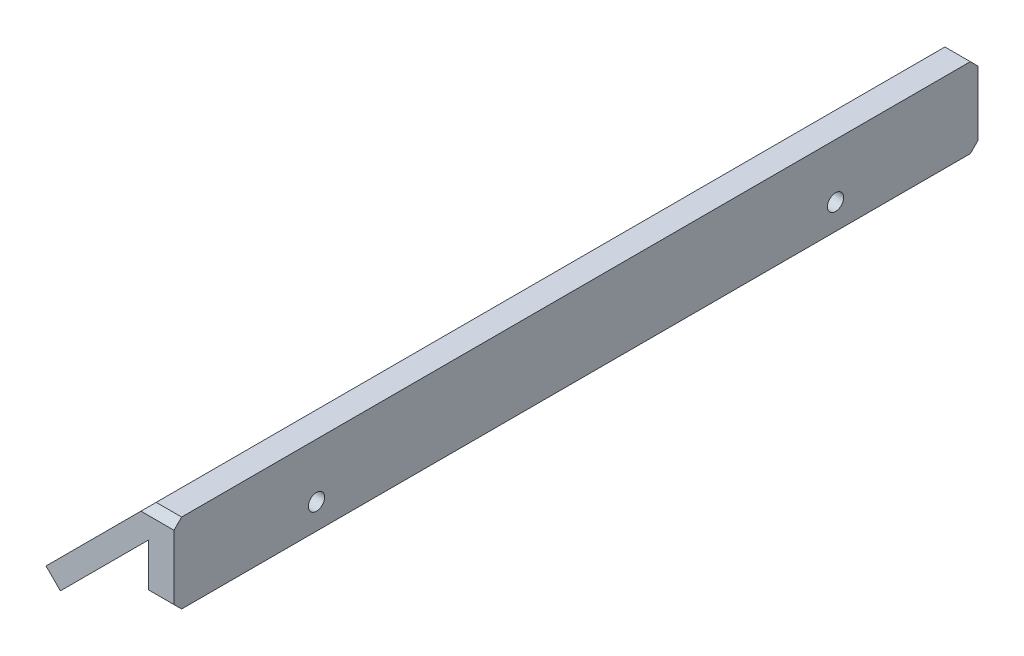
ISO-10303-21;
HEADER;
FILE_DESCRIPTION(('STEP AP214'),'2;1');
FILE_NAME('part.step','',(''),(''),'','','');
FILE_SCHEMA(('AUTOMOTIVE_DESIGN { 1 0 10303 214 1 1 1 1 }'));
ENDSEC;
DATA;
#1=APPLICATION_CONTEXT('core data for automotive mechanical design processes');
#2=APPLICATION_PROTOCOL_DEFINITION('international standard','automotive_design',2000,#1);
#3=PRODUCT_CONTEXT('',#1,'mechanical');
#4=PRODUCT('Part','Part','',(#3));
#5=PRODUCT_RELATED_PRODUCT_CATEGORY('part','',(#4));
#6=PRODUCT_DEFINITION_FORMATION('','',#4);
#7=PRODUCT_DEFINITION_CONTEXT('part definition',#1,'design');
#8=PRODUCT_DEFINITION('design','',#6,#7);
#9=PRODUCT_DEFINITION_SHAPE('','',#8);
#10=(LENGTH_UNIT() NAMED_UNIT(*) SI_UNIT(.MILLI.,.METRE.));
#11=(NAMED_UNIT(*) PLANE_ANGLE_UNIT() SI_UNIT($,.RADIAN.));
#12=(NAMED_UNIT(*) SI_UNIT($,.STERADIAN.) SOLID_ANGLE_UNIT());
#13=UNCERTAINTY_MEASURE_WITH_UNIT(LENGTH_MEASURE(1.E-05),#10,'distance_accuracy_value','');
#14=(GEOMETRIC_REPRESENTATION_CONTEXT(3) GLOBAL_UNCERTAINTY_ASSIGNED_CONTEXT((#13)) GLOBAL_UNIT_ASSIGNED_CONTEXT((#10,
#11,#12)) REPRESENTATION_CONTEXT('',''));
#15=CARTESIAN_POINT('',(0.,0.,0.));
#16=DIRECTION('',(0.,0.,1.));
#17=DIRECTION('',(1.,0.,0.));
#18=AXIS2_PLACEMENT_3D('',#15,#16,#17);
#19=CARTESIAN_POINT('',(-43.8051788486157,37.570905739196,158.));
#20=DIRECTION('',(-1.,0.,0.));
#21=DIRECTION('',(0.,0.,1.));
#22=AXIS2_PLACEMENT_3D('',#19,#20,#21);
#23=PLANE('',#22);
#24=CARTESIAN_POINT('',(-43.8051788486157,42.570905739196,130.));
#25=DIRECTION('',(1.,0.,0.));
#26=DIRECTION('',(0.,0.,-1.));
#27=AXIS2_PLACEMENT_3D('',#24,#25,#26);
#28=CIRCLE('',#27,1.59999999999999);
#29=CARTESIAN_POINT('',(-43.8051788486157,42.570905739196,128.4));
#30=VERTEX_POINT('',#29);
#31=EDGE_CURVE('E169',#30,#30,#28,.T.);
#32=ORIENTED_EDGE('',*,*,#31,.F.);
#33=EDGE_LOOP('',(#32));
#34=FACE_BOUND('',#33,.T.);
#35=CARTESIAN_POINT('',(-43.8051788486157,42.570905739196,28.));
#36=DIRECTION('',(1.,0.,0.));
#37=DIRECTION('',(0.,0.,-1.));
#38=AXIS2_PLACEMENT_3D('',#35,#36,#37);
#39=CIRCLE('',#38,1.6);
#40=CARTESIAN_POINT('',(-43.8051788486157,42.570905739196,26.4));
#41=VERTEX_POINT('',#40);
#42=EDGE_CURVE('E216',#41,#41,#39,.T.);
#43=ORIENTED_EDGE('',*,*,#42,.F.);
#44=EDGE_LOOP('',(#43));
#45=FACE_BOUND('',#44,.T.);
#46=DIRECTION('',(0.,1.,0.));
#47=VECTOR('',#46,1.);
#48=CARTESIAN_POINT('',(-43.8051788486157,37.570905739196,158.));
#49=LINE('',#48,#47);
#50=CARTESIAN_POINT('',(-43.8051788486157,39.070905739196,158.));
#51=VERTEX_POINT('',#50);
#52=CARTESIAN_POINT('',(-43.8051788486157,51.7277599886882,158.));
#53=VERTEX_POINT('',#52);
#54=EDGE_CURVE('E199',#51,#53,#49,.T.);
#55=ORIENTED_EDGE('',*,*,#54,.F.);
#56=DIRECTION('',(0.,0.707106781186547,0.707106781186547));
#57=VECTOR('',#56,1.);
#58=CARTESIAN_POINT('',(-43.8051788486157,37.570905739196,156.5));
#59=LINE('',#58,#57);
#60=CARTESIAN_POINT('',(-43.8051788486157,37.570905739196,156.5));
#61=VERTEX_POINT('',#60);
#62=EDGE_CURVE('E202',#61,#51,#59,.T.);
#63=ORIENTED_EDGE('',*,*,#62,.F.);
#64=DIRECTION('',(0.,0.,-1.));
#65=VECTOR('',#64,1.);
#66=CARTESIAN_POINT('',(-43.8051788486157,37.570905739196,158.));
#67=LINE('',#66,#65);
#68=CARTESIAN_POINT('',(-43.8051788486157,37.570905739196,1.5));
#69=VERTEX_POINT('',#68);
#70=EDGE_CURVE('E222',#61,#69,#67,.T.);
#71=ORIENTED_EDGE('',*,*,#70,.T.);
#72=DIRECTION('',(0.,-0.707106781186548,0.707106781186547));
#73=VECTOR('',#72,1.);
#74=CARTESIAN_POINT('',(-43.8051788486157,37.570905739196,1.5));
#75=LINE('',#74,#73);
#76=CARTESIAN_POINT('',(-43.8051788486157,39.070905739196,0.));
#77=VERTEX_POINT('',#76);
#78=EDGE_CURVE('E251',#77,#69,#75,.T.);
#79=ORIENTED_EDGE('',*,*,#78,.F.);
#80=DIRECTION('',(0.,1.,0.));
#81=VECTOR('',#80,1.);
#82=CARTESIAN_POINT('',(-43.8051788486157,37.570905739196,0.));
#83=LINE('',#82,#81);
#84=CARTESIAN_POINT('',(-43.8051788486157,51.7277599886882,0.));
#85=VERTEX_POINT('',#84);
#86=EDGE_CURVE('E172',#77,#85,#83,.T.);
#87=ORIENTED_EDGE('',*,*,#86,.T.);
#88=DIRECTION('',(0.,-0.707106781186548,-0.707106781186547));
#89=VECTOR('',#88,1.);
#90=CARTESIAN_POINT('',(-43.8051788486157,51.7277599886882,0.));
#91=LINE('',#90,#89);
#92=CARTESIAN_POINT('',(-43.8051788486157,53.2277599886882,1.5));
#93=VERTEX_POINT('',#92);
#94=EDGE_CURVE('E258',#93,#85,#91,.T.);
#95=ORIENTED_EDGE('',*,*,#94,.F.);
#96=DIRECTION('',(0.,0.,-1.));
#97=VECTOR('',#96,1.);
#98=CARTESIAN_POINT('',(-43.8051788486157,53.2277599886882,158.));
#99=LINE('',#98,#97);
#100=CARTESIAN_POINT('',(-43.8051788486157,53.2277599886882,156.5));
#101=VERTEX_POINT('',#100);
#102=EDGE_CURVE('E156',#101,#93,#99,.T.);
#103=ORIENTED_EDGE('',*,*,#102,.F.);
#104=DIRECTION('',(0.,0.707106781186547,-0.707106781186547));
#105=VECTOR('',#104,1.);
#106=CARTESIAN_POINT('',(-43.8051788486157,53.2277599886882,156.5));
#107=LINE('',#106,#105);
#108=EDGE_CURVE('E189',#53,#101,#107,.T.);
#109=ORIENTED_EDGE('',*,*,#108,.F.);
#110=EDGE_LOOP('',(#55,#63,#71,#79,#87,#95,#103,#109));
#111=FACE_BOUND('',#110,.T.);
#112=ADVANCED_FACE('F41',(#34,#45,#111),#23,.F.);
#113=CARTESIAN_POINT('',(-43.8051788486157,53.2277599886882,158.));
#114=DIRECTION('',(0.,-1.,0.));
#115=DIRECTION('',(1.,0.,0.));
#116=AXIS2_PLACEMENT_3D('',#113,#114,#115);
#117=PLANE('',#116);
#118=ORIENTED_EDGE('',*,*,#102,.T.);
#119=DIRECTION('',(1.,0.,0.));
#120=VECTOR('',#119,1.);
#121=CARTESIAN_POINT('',(-53.8051788486157,53.2277599886882,1.5));
#122=LINE('',#121,#120);
#123=CARTESIAN_POINT('',(-48.8051788486157,53.2277599886882,1.5));
#124=VERTEX_POINT('',#123);
#125=EDGE_CURVE('E255',#124,#93,#122,.T.);
#126=ORIENTED_EDGE('',*,*,#125,.F.);
#127=DIRECTION('',(0.,0.,-1.));
#128=VECTOR('',#127,1.);
#129=CARTESIAN_POINT('',(-48.8051788486157,53.2277599886882,158.));
#130=LINE('',#129,#128);
#131=CARTESIAN_POINT('',(-48.8051788486157,53.2277599886882,156.5));
#132=VERTEX_POINT('',#131);
#133=EDGE_CURVE('E153',#132,#124,#130,.T.);
#134=ORIENTED_EDGE('',*,*,#133,.F.);
#135=DIRECTION('',(1.,0.,0.));
#136=VECTOR('',#135,1.);
#137=CARTESIAN_POINT('',(-53.8051788486157,53.2277599886882,156.5));
#138=LINE('',#137,#136);
#139=EDGE_CURVE('E201',#132,#101,#138,.T.);
#140=ORIENTED_EDGE('',*,*,#139,.T.);
#141=EDGE_LOOP('',(#118,#126,#134,#140));
#142=FACE_BOUND('',#141,.T.);
#143=ADVANCED_FACE('F300',(#142),#117,.F.);
#144=CARTESIAN_POINT('',(-48.8051788486157,53.2277599886882,158.));
#145=DIRECTION('',(0.707106781186543,-0.707106781186552,0.));
#146=DIRECTION('',(0.707106781186552,0.707106781186543,0.));
#147=AXIS2_PLACEMENT_3D('',#144,#145,#146);
#148=PLANE('',#147);
#149=CARTESIAN_POINT('',(-59.411780566414,42.6211582708901,148.));
#150=DIRECTION('',(-0.707106781186543,0.707106781186552,0.));
#151=DIRECTION('',(-0.707106781186552,-0.707106781186543,0.));
#152=AXIS2_PLACEMENT_3D('',#149,#150,#151);
#153=CIRCLE('',#152,2.2);
#154=CARTESIAN_POINT('',(-60.9674154850244,41.0655233522797,148.));
#155=VERTEX_POINT('',#154);
#156=EDGE_CURVE('E177',#155,#155,#153,.T.);
#157=ORIENTED_EDGE('',*,*,#156,.F.);
#158=EDGE_LOOP('',(#157));
#159=FACE_BOUND('',#158,.T.);
#160=CARTESIAN_POINT('',(-59.411780566414,42.6211582708901,10.));
#161=DIRECTION('',(-0.707106781186543,0.707106781186552,0.));
#162=DIRECTION('',(-0.707106781186552,-0.707106781186543,0.));
#163=AXIS2_PLACEMENT_3D('',#160,#161,#162);
#164=CIRCLE('',#163,2.2);
#165=CARTESIAN_POINT('',(-60.9674154850244,41.0655233522797,10.));
#166=VERTEX_POINT('',#165);
#167=EDGE_CURVE('E275',#166,#166,#164,.T.);
#168=ORIENTED_EDGE('',*,*,#167,.F.);
#169=EDGE_LOOP('',(#168));
#170=FACE_BOUND('',#169,.T.);
#171=CARTESIAN_POINT('',(-59.4620330981081,42.570905739196,130.));
#172=DIRECTION('',(0.707106781186543,-0.707106781186552,0.));
#173=DIRECTION('',(0.707106781186552,0.707106781186543,0.));
#174=AXIS2_PLACEMENT_3D('',#171,#172,#173);
#175=ELLIPSE('',#174,4.94974746830586,3.49999999999999);
#176=CARTESIAN_POINT('',(-55.9620330981081,46.070905739196,130.));
#177=VERTEX_POINT('',#176);
#178=EDGE_CURVE('E288',#177,#177,#175,.F.);
#179=ORIENTED_EDGE('',*,*,#178,.F.);
#180=EDGE_LOOP('',(#179));
#181=FACE_BOUND('',#180,.T.);
#182=CARTESIAN_POINT('',(-59.4620330981081,42.570905739196,28.));
#183=DIRECTION('',(0.707106781186543,-0.707106781186552,0.));
#184=DIRECTION('',(0.707106781186552,0.707106781186543,0.));
#185=AXIS2_PLACEMENT_3D('',#182,#183,#184);
#186=ELLIPSE('',#185,4.94974746830586,3.5);
#187=CARTESIAN_POINT('',(-55.9620330981081,46.070905739196,28.));
#188=VERTEX_POINT('',#187);
#189=EDGE_CURVE('E282',#188,#188,#186,.F.);
#190=ORIENTED_EDGE('',*,*,#189,.F.);
#191=EDGE_LOOP('',(#190));
#192=FACE_BOUND('',#191,.T.);
#193=DIRECTION('',(0.,0.,-1.));
#194=VECTOR('',#193,1.);
#195=CARTESIAN_POINT('',(-70.0183822842123,32.0145565530919,158.));
#196=LINE('',#195,#194);
#197=CARTESIAN_POINT('',(-70.0183822842123,32.0145565530919,156.5));
#198=VERTEX_POINT('',#197);
#199=CARTESIAN_POINT('',(-70.0183822842123,32.0145565530919,1.5));
#200=VERTEX_POINT('',#199);
#201=EDGE_CURVE('E147',#198,#200,#196,.T.);
#202=ORIENTED_EDGE('',*,*,#201,.F.);
#203=DIRECTION('',(0.500000000000003,0.499999999999999,0.707106781186546));
#204=VECTOR('',#203,1.);
#205=CARTESIAN_POINT('',(-70.0183822842123,32.0145565530919,156.5));
#206=LINE('',#205,#204);
#207=CARTESIAN_POINT('',(-68.9577221124324,33.0752167248717,158.));
#208=VERTEX_POINT('',#207);
#209=EDGE_CURVE('E132',#198,#208,#206,.T.);
#210=ORIENTED_EDGE('',*,*,#209,.T.);
#211=DIRECTION('',(-0.707106781186552,-0.707106781186543,0.));
#212=VECTOR('',#211,1.);
#213=CARTESIAN_POINT('',(-48.8051788486157,53.2277599886882,158.));
#214=LINE('',#213,#212);
#215=CARTESIAN_POINT('',(-50.3051788486157,51.7277599886882,158.));
#216=VERTEX_POINT('',#215);
#217=EDGE_CURVE('E207',#216,#208,#214,.T.);
#218=ORIENTED_EDGE('',*,*,#217,.F.);
#219=DIRECTION('',(0.577350269189631,0.577350269189623,-0.577350269189623));
#220=VECTOR('',#219,1.);
#221=CARTESIAN_POINT('',(-49.3051788486157,52.7277599886882,157.));
#222=LINE('',#221,#220);
#223=EDGE_CURVE('E192',#216,#132,#222,.T.);
#224=ORIENTED_EDGE('',*,*,#223,.T.);
#225=ORIENTED_EDGE('',*,*,#133,.T.);
#226=DIRECTION('',(-0.577350269189631,-0.577350269189624,-0.577350269189623));
#227=VECTOR('',#226,1.);
#228=CARTESIAN_POINT('',(3.36148781805116,105.394426655354,53.6666666666662));
#229=LINE('',#228,#227);
#230=CARTESIAN_POINT('',(-50.3051788486158,51.7277599886882,0.));
#231=VERTEX_POINT('',#230);
#232=EDGE_CURVE('E269',#124,#231,#229,.T.);
#233=ORIENTED_EDGE('',*,*,#232,.T.);
#234=DIRECTION('',(-0.707106781186552,-0.707106781186543,0.));
#235=VECTOR('',#234,1.);
#236=CARTESIAN_POINT('',(-48.8051788486157,53.2277599886882,0.));
#237=LINE('',#236,#235);
#238=CARTESIAN_POINT('',(-68.9577221124324,33.0752167248718,0.));
#239=VERTEX_POINT('',#238);
#240=EDGE_CURVE('E225',#231,#239,#237,.T.);
#241=ORIENTED_EDGE('',*,*,#240,.T.);
#242=DIRECTION('',(-0.500000000000004,-0.499999999999999,0.707106781186546));
#243=VECTOR('',#242,1.);
#244=CARTESIAN_POINT('',(-70.0183822842123,32.0145565530919,1.5));
#245=LINE('',#244,#243);
#246=EDGE_CURVE('E63',#239,#200,#245,.T.);
#247=ORIENTED_EDGE('',*,*,#246,.T.);
#248=EDGE_LOOP('',(#202,#210,#218,#224,#225,#233,#241,#247));
#249=FACE_BOUND('',#248,.T.);
#250=ADVANCED_FACE('F151',(#159,#170,#181,#192,#249),#148,.F.);
#251=CARTESIAN_POINT('',(-70.0183822842123,32.0145565530919,158.));
#252=DIRECTION('',(0.707106781186548,0.707106781186548,0.));
#253=DIRECTION('',(-0.707106781186548,0.707106781186548,0.));
#254=AXIS2_PLACEMENT_3D('',#251,#252,#253);
#255=PLANE('',#254);
#256=DIRECTION('',(0.,0.,-1.));
#257=VECTOR('',#256,1.);
#258=CARTESIAN_POINT('',(-67.1899551594661,29.1861294283457,158.));
#259=LINE('',#258,#257);
#260=CARTESIAN_POINT('',(-67.1899551594661,29.1861294283457,156.5));
#261=VERTEX_POINT('',#260);
#262=CARTESIAN_POINT('',(-67.1899551594661,29.1861294283457,1.5));
#263=VERTEX_POINT('',#262);
#264=EDGE_CURVE('E149',#261,#263,#259,.T.);
#265=ORIENTED_EDGE('',*,*,#264,.F.);
#266=DIRECTION('',(0.707106781186548,-0.707106781186547,0.));
#267=VECTOR('',#266,1.);
#268=CARTESIAN_POINT('',(-70.0183822842123,32.0145565530919,156.5));
#269=LINE('',#268,#267);
#270=EDGE_CURVE('E135',#198,#261,#269,.T.);
#271=ORIENTED_EDGE('',*,*,#270,.F.);
#272=ORIENTED_EDGE('',*,*,#201,.T.);
#273=DIRECTION('',(0.707106781186548,-0.707106781186547,0.));
#274=VECTOR('',#273,1.);
#275=CARTESIAN_POINT('',(-70.0183822842123,32.0145565530919,1.5));
#276=LINE('',#275,#274);
#277=EDGE_CURVE('E489',#200,#263,#276,.T.);
#278=ORIENTED_EDGE('',*,*,#277,.T.);
#279=EDGE_LOOP('',(#265,#271,#272,#278));
#280=FACE_BOUND('',#279,.T.);
#281=ADVANCED_FACE('F145',(#280),#255,.F.);
#282=CARTESIAN_POINT('',(-67.1899551594661,29.1861294283457,158.));
#283=DIRECTION('',(-0.707106781186548,0.707106781186547,0.));
#284=DIRECTION('',(-0.707106781186547,-0.707106781186548,0.));
#285=AXIS2_PLACEMENT_3D('',#282,#283,#284);
#286=PLANE('',#285);
#287=CARTESIAN_POINT('',(-56.5833534416679,39.7927311461439,148.));
#288=DIRECTION('',(-0.707106781186548,0.707106781186547,0.));
#289=DIRECTION('',(-0.707106781186547,-0.707106781186548,0.));
#290=AXIS2_PLACEMENT_3D('',#287,#288,#289);
#291=CIRCLE('',#290,2.2);
#292=CARTESIAN_POINT('',(-58.1389883602783,38.2370962275335,148.));
#293=VERTEX_POINT('',#292);
#294=EDGE_CURVE('E176',#293,#293,#291,.T.);
#295=ORIENTED_EDGE('',*,*,#294,.T.);
#296=EDGE_LOOP('',(#295));
#297=FACE_BOUND('',#296,.T.);
#298=CARTESIAN_POINT('',(-56.5833534416679,39.7927311461439,10.));
#299=DIRECTION('',(-0.707106781186548,0.707106781186547,0.));
#300=DIRECTION('',(-0.707106781186547,-0.707106781186548,0.));
#301=AXIS2_PLACEMENT_3D('',#298,#299,#300);
#302=CIRCLE('',#301,2.2);
#303=CARTESIAN_POINT('',(-58.1389883602783,38.2370962275335,10.));
#304=VERTEX_POINT('',#303);
#305=EDGE_CURVE('E173',#304,#304,#302,.T.);
#306=ORIENTED_EDGE('',*,*,#305,.T.);
#307=EDGE_LOOP('',(#306));
#308=FACE_BOUND('',#307,.T.);
#309=CARTESIAN_POINT('',(-53.8051788486159,42.570905739196,130.));
#310=DIRECTION('',(-0.707106781186548,0.707106781186547,0.));
#311=DIRECTION('',(0.707106781186547,0.707106781186548,0.));
#312=AXIS2_PLACEMENT_3D('',#309,#310,#311);
#313=ELLIPSE('',#312,4.94974746830582,3.49999999999999);
#314=CARTESIAN_POINT('',(-50.3051788486159,46.070905739196,130.));
#315=VERTEX_POINT('',#314);
#316=EDGE_CURVE('E285',#315,#315,#313,.F.);
#317=ORIENTED_EDGE('',*,*,#316,.F.);
#318=EDGE_LOOP('',(#317));
#319=FACE_BOUND('',#318,.T.);
#320=CARTESIAN_POINT('',(-53.8051788486159,42.570905739196,28.));
#321=DIRECTION('',(-0.707106781186548,0.707106781186547,0.));
#322=DIRECTION('',(0.707106781186547,0.707106781186548,0.));
#323=AXIS2_PLACEMENT_3D('',#320,#321,#322);
#324=ELLIPSE('',#323,4.94974746830583,3.5);
#325=CARTESIAN_POINT('',(-50.3051788486159,46.070905739196,28.));
#326=VERTEX_POINT('',#325);
#327=EDGE_CURVE('E180',#326,#326,#324,.F.);
#328=ORIENTED_EDGE('',*,*,#327,.F.);
#329=EDGE_LOOP('',(#328));
#330=FACE_BOUND('',#329,.T.);
#331=DIRECTION('',(0.707106781186547,0.707106781186548,0.));
#332=VECTOR('',#331,1.);
#333=CARTESIAN_POINT('',(-67.1899551594661,29.1861294283457,158.));
#334=LINE('',#333,#332);
#335=CARTESIAN_POINT('',(-66.1292949876863,30.2467896001256,158.));
#336=VERTEX_POINT('',#335);
#337=CARTESIAN_POINT('',(-48.8051788486159,47.570905739196,158.));
#338=VERTEX_POINT('',#337);
#339=EDGE_CURVE('E210',#336,#338,#334,.T.);
#340=ORIENTED_EDGE('',*,*,#339,.F.);
#341=DIRECTION('',(0.500000000000003,0.499999999999999,0.707106781186546));
#342=VECTOR('',#341,1.);
#343=CARTESIAN_POINT('',(-67.1899551594661,29.1861294283457,156.5));
#344=LINE('',#343,#342);
#345=EDGE_CURVE('E55',#261,#336,#344,.T.);
#346=ORIENTED_EDGE('',*,*,#345,.F.);
#347=ORIENTED_EDGE('',*,*,#264,.T.);
#348=DIRECTION('',(-0.500000000000004,-0.499999999999999,0.707106781186546));
#349=VECTOR('',#348,1.);
#350=CARTESIAN_POINT('',(-67.1899551594661,29.1861294283457,1.5));
#351=LINE('',#350,#349);
#352=CARTESIAN_POINT('',(-66.1292949876862,30.2467896001256,0.));
#353=VERTEX_POINT('',#352);
#354=EDGE_CURVE('E488',#353,#263,#351,.T.);
#355=ORIENTED_EDGE('',*,*,#354,.F.);
#356=DIRECTION('',(0.707106781186547,0.707106781186548,0.));
#357=VECTOR('',#356,1.);
#358=CARTESIAN_POINT('',(-67.1899551594661,29.1861294283457,0.));
#359=LINE('',#358,#357);
#360=CARTESIAN_POINT('',(-48.8051788486159,47.570905739196,0.));
#361=VERTEX_POINT('',#360);
#362=EDGE_CURVE('E213',#353,#361,#359,.T.);
#363=ORIENTED_EDGE('',*,*,#362,.T.);
#364=DIRECTION('',(0.,0.,-1.));
#365=VECTOR('',#364,1.);
#366=CARTESIAN_POINT('',(-48.8051788486159,47.570905739196,158.));
#367=LINE('',#366,#365);
#368=EDGE_CURVE('E158',#338,#361,#367,.T.);
#369=ORIENTED_EDGE('',*,*,#368,.F.);
#370=EDGE_LOOP('',(#340,#346,#347,#355,#363,#369));
#371=FACE_BOUND('',#370,.T.);
#372=ADVANCED_FACE('F316',(#297,#308,#319,#330,#371),#286,.F.);
#373=CARTESIAN_POINT('',(-48.8051788486159,47.570905739196,158.));
#374=DIRECTION('',(1.,0.,0.));
#375=DIRECTION('',(0.,0.,-1.));
#376=AXIS2_PLACEMENT_3D('',#373,#374,#375);
#377=PLANE('',#376);
#378=DIRECTION('',(0.,0.,-1.));
#379=VECTOR('',#378,1.);
#380=CARTESIAN_POINT('',(-48.8051788486159,37.570905739196,158.));
#381=LINE('',#380,#379);
#382=CARTESIAN_POINT('',(-48.8051788486159,37.570905739196,156.5));
#383=VERTEX_POINT('',#382);
#384=CARTESIAN_POINT('',(-48.8051788486159,37.570905739196,1.5));
#385=VERTEX_POINT('',#384);
#386=EDGE_CURVE('E230',#383,#385,#381,.T.);
#387=ORIENTED_EDGE('',*,*,#386,.F.);
#388=DIRECTION('',(0.,0.707106781186548,0.707106781186548));
#389=VECTOR('',#388,1.);
#390=CARTESIAN_POINT('',(-48.8051788486159,43.320905739196,162.25));
#391=LINE('',#390,#389);
#392=CARTESIAN_POINT('',(-48.8051788486159,39.070905739196,158.));
#393=VERTEX_POINT('',#392);
#394=EDGE_CURVE('E273',#383,#393,#391,.T.);
#395=ORIENTED_EDGE('',*,*,#394,.T.);
#396=DIRECTION('',(0.,-1.,0.));
#397=VECTOR('',#396,1.);
#398=CARTESIAN_POINT('',(-48.8051788486159,47.570905739196,158.));
#399=LINE('',#398,#397);
#400=EDGE_CURVE('E220',#338,#393,#399,.T.);
#401=ORIENTED_EDGE('',*,*,#400,.F.);
#402=ORIENTED_EDGE('',*,*,#368,.T.);
#403=DIRECTION('',(0.,-1.,0.));
#404=VECTOR('',#403,1.);
#405=CARTESIAN_POINT('',(-48.8051788486159,47.570905739196,0.));
#406=LINE('',#405,#404);
#407=CARTESIAN_POINT('',(-48.8051788486159,39.070905739196,0.));
#408=VERTEX_POINT('',#407);
#409=EDGE_CURVE('E208',#361,#408,#406,.T.);
#410=ORIENTED_EDGE('',*,*,#409,.T.);
#411=DIRECTION('',(0.,-0.707106781186548,0.707106781186547));
#412=VECTOR('',#411,1.);
#413=CARTESIAN_POINT('',(-48.8051788486159,-35.679094260804,74.7499999999999));
#414=LINE('',#413,#412);
#415=EDGE_CURVE('E253',#408,#385,#414,.T.);
#416=ORIENTED_EDGE('',*,*,#415,.T.);
#417=EDGE_LOOP('',(#387,#395,#401,#402,#410,#416));
#418=FACE_BOUND('',#417,.T.);
#419=CARTESIAN_POINT('',(-48.8051788486159,42.570905739196,28.));
#420=DIRECTION('',(1.,0.,0.));
#421=DIRECTION('',(0.,0.,-1.));
#422=AXIS2_PLACEMENT_3D('',#419,#420,#421);
#423=CIRCLE('',#422,1.6);
#424=CARTESIAN_POINT('',(-48.8051788486159,42.570905739196,26.4));
#425=VERTEX_POINT('',#424);
#426=EDGE_CURVE('E165',#425,#425,#423,.T.);
#427=ORIENTED_EDGE('',*,*,#426,.T.);
#428=EDGE_LOOP('',(#427));
#429=FACE_BOUND('',#428,.T.);
#430=CARTESIAN_POINT('',(-48.8051788486159,42.570905739196,130.));
#431=DIRECTION('',(1.,0.,0.));
#432=DIRECTION('',(0.,0.,-1.));
#433=AXIS2_PLACEMENT_3D('',#430,#431,#432);
#434=CIRCLE('',#433,1.59999999999999);
#435=CARTESIAN_POINT('',(-48.8051788486159,42.570905739196,128.4));
#436=VERTEX_POINT('',#435);
#437=EDGE_CURVE('E168',#436,#436,#434,.T.);
#438=ORIENTED_EDGE('',*,*,#437,.T.);
#439=EDGE_LOOP('',(#438));
#440=FACE_BOUND('',#439,.T.);
#441=ADVANCED_FACE('F238',(#418,#429,#440),#377,.F.);
#442=CARTESIAN_POINT('',(-48.8051788486159,37.570905739196,158.));
#443=DIRECTION('',(0.,1.,0.));
#444=DIRECTION('',(0.,0.,1.));
#445=AXIS2_PLACEMENT_3D('',#442,#443,#444);
#446=PLANE('',#445);
#447=ORIENTED_EDGE('',*,*,#70,.F.);
#448=DIRECTION('',(1.,0.,0.));
#449=VECTOR('',#448,1.);
#450=CARTESIAN_POINT('',(-53.8051788486157,37.570905739196,156.5));
#451=LINE('',#450,#449);
#452=EDGE_CURVE('E263',#383,#61,#451,.T.);
#453=ORIENTED_EDGE('',*,*,#452,.F.);
#454=ORIENTED_EDGE('',*,*,#386,.T.);
#455=DIRECTION('',(1.,0.,0.));
#456=VECTOR('',#455,1.);
#457=CARTESIAN_POINT('',(-53.8051788486157,37.570905739196,1.5));
#458=LINE('',#457,#456);
#459=EDGE_CURVE('E256',#385,#69,#458,.T.);
#460=ORIENTED_EDGE('',*,*,#459,.T.);
#461=EDGE_LOOP('',(#447,#453,#454,#460));
#462=FACE_BOUND('',#461,.T.);
#463=ADVANCED_FACE('F321',(#462),#446,.F.);
#464=CARTESIAN_POINT('',(0.,0.,158.));
#465=DIRECTION('',(0.,0.,1.));
#466=DIRECTION('',(1.,0.,0.));
#467=AXIS2_PLACEMENT_3D('',#464,#465,#466);
#468=PLANE('',#467);
#469=DIRECTION('',(0.707106781186548,-0.707106781186547,0.));
#470=VECTOR('',#469,1.);
#471=CARTESIAN_POINT('',(-68.9577221124324,33.0752167248717,158.));
#472=LINE('',#471,#470);
#473=EDGE_CURVE('E136',#208,#336,#472,.T.);
#474=ORIENTED_EDGE('',*,*,#473,.T.);
#475=ORIENTED_EDGE('',*,*,#339,.T.);
#476=ORIENTED_EDGE('',*,*,#400,.T.);
#477=DIRECTION('',(-1.,0.,0.));
#478=VECTOR('',#477,1.);
#479=CARTESIAN_POINT('',(0.,39.070905739196,158.));
#480=LINE('',#479,#478);
#481=EDGE_CURVE('E11',#51,#393,#480,.T.);
#482=ORIENTED_EDGE('',*,*,#481,.F.);
#483=ORIENTED_EDGE('',*,*,#54,.T.);
#484=DIRECTION('',(1.,0.,0.));
#485=VECTOR('',#484,1.);
#486=CARTESIAN_POINT('',(0.,51.7277599886882,158.));
#487=LINE('',#486,#485);
#488=EDGE_CURVE('E48',#216,#53,#487,.T.);
#489=ORIENTED_EDGE('',*,*,#488,.F.);
#490=ORIENTED_EDGE('',*,*,#217,.T.);
#491=EDGE_LOOP('',(#474,#475,#476,#482,#483,#489,#490));
#492=FACE_BOUND('',#491,.T.);
#493=ADVANCED_FACE('F205',(#492),#468,.T.);
#494=CARTESIAN_POINT('',(0.,0.,0.));
#495=DIRECTION('',(0.,0.,1.));
#496=DIRECTION('',(1.,0.,0.));
#497=AXIS2_PLACEMENT_3D('',#494,#495,#496);
#498=PLANE('',#497);
#499=ORIENTED_EDGE('',*,*,#362,.F.);
#500=DIRECTION('',(0.707106781186548,-0.707106781186547,0.));
#501=VECTOR('',#500,1.);
#502=CARTESIAN_POINT('',(-68.9577221124324,33.0752167248717,0.));
#503=LINE('',#502,#501);
#504=EDGE_CURVE('E490',#239,#353,#503,.T.);
#505=ORIENTED_EDGE('',*,*,#504,.F.);
#506=ORIENTED_EDGE('',*,*,#240,.F.);
#507=DIRECTION('',(1.,0.,0.));
#508=VECTOR('',#507,1.);
#509=CARTESIAN_POINT('',(0.,51.7277599886882,0.));
#510=LINE('',#509,#508);
#511=EDGE_CURVE('E183',#231,#85,#510,.T.);
#512=ORIENTED_EDGE('',*,*,#511,.T.);
#513=ORIENTED_EDGE('',*,*,#86,.F.);
#514=DIRECTION('',(-1.,0.,0.));
#515=VECTOR('',#514,1.);
#516=CARTESIAN_POINT('',(0.,39.070905739196,0.));
#517=LINE('',#516,#515);
#518=EDGE_CURVE('E164',#77,#408,#517,.T.);
#519=ORIENTED_EDGE('',*,*,#518,.T.);
#520=ORIENTED_EDGE('',*,*,#409,.F.);
#521=EDGE_LOOP('',(#499,#505,#506,#512,#513,#519,#520));
#522=FACE_BOUND('',#521,.T.);
#523=ADVANCED_FACE('F246',(#522),#498,.F.);
#524=CARTESIAN_POINT('',(-70.8051788486157,42.570905739196,28.));
#525=DIRECTION('',(1.,0.,0.));
#526=DIRECTION('',(0.,0.,-1.));
#527=AXIS2_PLACEMENT_3D('',#524,#525,#526);
#528=CYLINDRICAL_SURFACE('',#527,1.6);
#529=ORIENTED_EDGE('',*,*,#42,.T.);
#530=EDGE_LOOP('',(#529));
#531=FACE_BOUND('',#530,.T.);
#532=ORIENTED_EDGE('',*,*,#426,.F.);
#533=EDGE_LOOP('',(#532));
#534=FACE_BOUND('',#533,.T.);
#535=ADVANCED_FACE('F296',(#531,#534),#528,.F.);
#536=CARTESIAN_POINT('',(-70.8051788486157,42.570905739196,130.));
#537=DIRECTION('',(1.,0.,0.));
#538=DIRECTION('',(0.,0.,-1.));
#539=AXIS2_PLACEMENT_3D('',#536,#537,#538);
#540=CYLINDRICAL_SURFACE('',#539,1.59999999999999);
#541=ORIENTED_EDGE('',*,*,#31,.T.);
#542=EDGE_LOOP('',(#541));
#543=FACE_BOUND('',#542,.T.);
#544=ORIENTED_EDGE('',*,*,#437,.F.);
#545=EDGE_LOOP('',(#544));
#546=FACE_BOUND('',#545,.T.);
#547=ADVANCED_FACE('F331',(#543,#546),#540,.F.);
#548=CARTESIAN_POINT('',(-69.8051788486159,42.570905739196,28.));
#549=DIRECTION('',(1.,0.,0.));
#550=DIRECTION('',(0.,0.,-1.));
#551=AXIS2_PLACEMENT_3D('',#548,#549,#550);
#552=CYLINDRICAL_SURFACE('',#551,3.5);
#553=ORIENTED_EDGE('',*,*,#327,.T.);
#554=EDGE_LOOP('',(#553));
#555=FACE_BOUND('',#554,.T.);
#556=ORIENTED_EDGE('',*,*,#189,.T.);
#557=EDGE_LOOP('',(#556));
#558=FACE_BOUND('',#557,.T.);
#559=ADVANCED_FACE('F334',(#555,#558),#552,.F.);
#560=CARTESIAN_POINT('',(-69.8051788486159,42.570905739196,130.));
#561=DIRECTION('',(1.,0.,0.));
#562=DIRECTION('',(0.,0.,-1.));
#563=AXIS2_PLACEMENT_3D('',#560,#561,#562);
#564=CYLINDRICAL_SURFACE('',#563,3.49999999999999);
#565=ORIENTED_EDGE('',*,*,#316,.T.);
#566=EDGE_LOOP('',(#565));
#567=FACE_BOUND('',#566,.T.);
#568=ORIENTED_EDGE('',*,*,#178,.T.);
#569=EDGE_LOOP('',(#568));
#570=FACE_BOUND('',#569,.T.);
#571=ADVANCED_FACE('F337',(#567,#570),#564,.F.);
#572=CARTESIAN_POINT('',(-55.8762466604813,39.0856243649573,10.));
#573=DIRECTION('',(-0.707106781186543,0.707106781186552,0.));
#574=DIRECTION('',(-0.707106781186552,-0.707106781186543,0.));
#575=AXIS2_PLACEMENT_3D('',#572,#573,#574);
#576=CYLINDRICAL_SURFACE('',#575,2.2);
#577=ORIENTED_EDGE('',*,*,#167,.T.);
#578=EDGE_LOOP('',(#577));
#579=FACE_BOUND('',#578,.T.);
#580=ORIENTED_EDGE('',*,*,#305,.F.);
#581=EDGE_LOOP('',(#580));
#582=FACE_BOUND('',#581,.T.);
#583=ADVANCED_FACE('F341',(#579,#582),#576,.F.);
#584=CARTESIAN_POINT('',(-55.8762466604813,39.0856243649573,148.));
#585=DIRECTION('',(-0.707106781186543,0.707106781186552,0.));
#586=DIRECTION('',(-0.707106781186552,-0.707106781186543,0.));
#587=AXIS2_PLACEMENT_3D('',#584,#585,#586);
#588=CYLINDRICAL_SURFACE('',#587,2.2);
#589=ORIENTED_EDGE('',*,*,#156,.T.);
#590=EDGE_LOOP('',(#589));
#591=FACE_BOUND('',#590,.T.);
#592=ORIENTED_EDGE('',*,*,#294,.F.);
#593=EDGE_LOOP('',(#592));
#594=FACE_BOUND('',#593,.T.);
#595=ADVANCED_FACE('F345',(#591,#594),#588,.F.);
#596=CARTESIAN_POINT('',(-53.8051788486157,37.570905739196,1.5));
#597=DIRECTION('',(0.,0.707106781186547,0.707106781186548));
#598=DIRECTION('',(0.,-0.707106781186548,0.707106781186547));
#599=AXIS2_PLACEMENT_3D('',#596,#597,#598);
#600=PLANE('',#599);
#601=ORIENTED_EDGE('',*,*,#518,.F.);
#602=ORIENTED_EDGE('',*,*,#78,.T.);
#603=ORIENTED_EDGE('',*,*,#459,.F.);
#604=ORIENTED_EDGE('',*,*,#415,.F.);
#605=EDGE_LOOP('',(#601,#602,#603,#604));
#606=FACE_BOUND('',#605,.T.);
#607=ADVANCED_FACE('F250',(#606),#600,.F.);
#608=CARTESIAN_POINT('',(-53.8051788486157,51.7277599886882,0.));
#609=DIRECTION('',(0.,-0.707106781186547,0.707106781186548));
#610=DIRECTION('',(0.,-0.707106781186548,-0.707106781186547));
#611=AXIS2_PLACEMENT_3D('',#608,#609,#610);
#612=PLANE('',#611);
#613=ORIENTED_EDGE('',*,*,#125,.T.);
#614=ORIENTED_EDGE('',*,*,#94,.T.);
#615=ORIENTED_EDGE('',*,*,#511,.F.);
#616=ORIENTED_EDGE('',*,*,#232,.F.);
#617=EDGE_LOOP('',(#613,#614,#615,#616));
#618=FACE_BOUND('',#617,.T.);
#619=ADVANCED_FACE('F352',(#618),#612,.F.);
#620=CARTESIAN_POINT('',(-53.8051788486157,53.2277599886882,156.5));
#621=DIRECTION('',(0.,-0.707106781186547,-0.707106781186547));
#622=DIRECTION('',(0.,0.707106781186548,-0.707106781186548));
#623=AXIS2_PLACEMENT_3D('',#620,#621,#622);
#624=PLANE('',#623);
#625=ORIENTED_EDGE('',*,*,#488,.T.);
#626=ORIENTED_EDGE('',*,*,#108,.T.);
#627=ORIENTED_EDGE('',*,*,#139,.F.);
#628=ORIENTED_EDGE('',*,*,#223,.F.);
#629=EDGE_LOOP('',(#625,#626,#627,#628));
#630=FACE_BOUND('',#629,.T.);
#631=ADVANCED_FACE('F188',(#630),#624,.F.);
#632=CARTESIAN_POINT('',(-53.8051788486157,37.570905739196,156.5));
#633=DIRECTION('',(0.,0.707106781186547,-0.707106781186547));
#634=DIRECTION('',(0.,0.707106781186548,0.707106781186548));
#635=AXIS2_PLACEMENT_3D('',#632,#633,#634);
#636=PLANE('',#635);
#637=ORIENTED_EDGE('',*,*,#452,.T.);
#638=ORIENTED_EDGE('',*,*,#62,.T.);
#639=ORIENTED_EDGE('',*,*,#481,.T.);
#640=ORIENTED_EDGE('',*,*,#394,.F.);
#641=EDGE_LOOP('',(#637,#638,#639,#640));
#642=FACE_BOUND('',#641,.T.);
#643=ADVANCED_FACE('F351',(#642),#636,.F.);
#644=CARTESIAN_POINT('',(-70.0183822842123,32.0145565530919,1.5));
#645=DIRECTION('',(0.499999999999999,0.499999999999999,0.707106781186549));
#646=DIRECTION('',(0.,-0.816496580927727,0.577350269189624));
#647=AXIS2_PLACEMENT_3D('',#644,#645,#646);
#648=PLANE('',#647);
#649=ORIENTED_EDGE('',*,*,#354,.T.);
#650=ORIENTED_EDGE('',*,*,#277,.F.);
#651=ORIENTED_EDGE('',*,*,#246,.F.);
#652=ORIENTED_EDGE('',*,*,#504,.T.);
#653=EDGE_LOOP('',(#649,#650,#651,#652));
#654=FACE_BOUND('',#653,.T.);
#655=ADVANCED_FACE('F358',(#654),#648,.F.);
#656=CARTESIAN_POINT('',(-70.0183822842123,32.0145565530919,156.5));
#657=DIRECTION('',(0.499999999999999,0.499999999999999,-0.707106781186549));
#658=DIRECTION('',(0.,0.816496580927727,0.577350269189624));
#659=AXIS2_PLACEMENT_3D('',#656,#657,#658);
#660=PLANE('',#659);
#661=ORIENTED_EDGE('',*,*,#345,.T.);
#662=ORIENTED_EDGE('',*,*,#473,.F.);
#663=ORIENTED_EDGE('',*,*,#209,.F.);
#664=ORIENTED_EDGE('',*,*,#270,.T.);
#665=EDGE_LOOP('',(#661,#662,#663,#664));
#666=FACE_BOUND('',#665,.T.);
#667=ADVANCED_FACE('F134',(#666),#660,.F.);
#668=CLOSED_SHELL('',(#112,#143,#250,#281,#372,#441,#463,#493,#523,#535,#547,#559,#571,#583,
#595,#607,#619,#631,#643,#655,#667));
#669=MANIFOLD_SOLID_BREP('B2',#668);
#670=ADVANCED_BREP_SHAPE_REPRESENTATION('',(#18,#669),#14);
#671=SHAPE_DEFINITION_REPRESENTATION(#9,#670);
ENDSEC;
END-ISO-10303-21;
